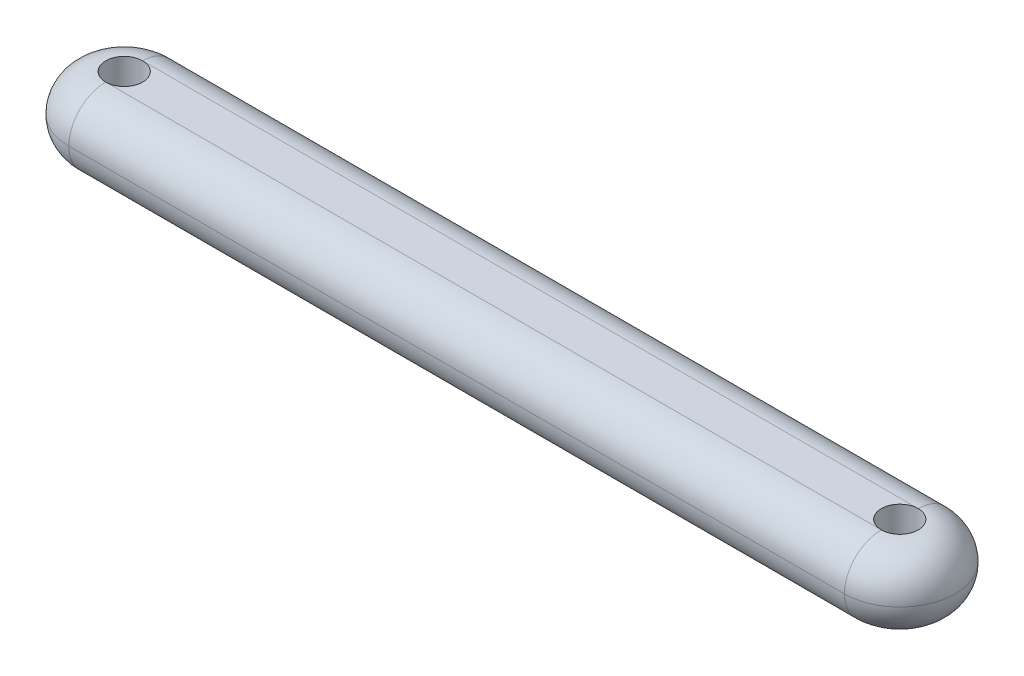
ISO-10303-21;
HEADER;
FILE_DESCRIPTION(('STEP AP214'),'2;1');
FILE_NAME('part.step','',(''),(''),'','','');
FILE_SCHEMA(('AUTOMOTIVE_DESIGN { 1 0 10303 214 1 1 1 1 }'));
ENDSEC;
DATA;
#1=APPLICATION_CONTEXT('core data for automotive mechanical design processes');
#2=APPLICATION_PROTOCOL_DEFINITION('international standard','automotive_design',2000,#1);
#3=PRODUCT_CONTEXT('',#1,'mechanical');
#4=PRODUCT('Part','Part','',(#3));
#5=PRODUCT_RELATED_PRODUCT_CATEGORY('part','',(#4));
#6=PRODUCT_DEFINITION_FORMATION('','',#4);
#7=PRODUCT_DEFINITION_CONTEXT('part definition',#1,'design');
#8=PRODUCT_DEFINITION('design','',#6,#7);
#9=PRODUCT_DEFINITION_SHAPE('','',#8);
#10=(LENGTH_UNIT() NAMED_UNIT(*) SI_UNIT(.MILLI.,.METRE.));
#11=(NAMED_UNIT(*) PLANE_ANGLE_UNIT() SI_UNIT($,.RADIAN.));
#12=(NAMED_UNIT(*) SI_UNIT($,.STERADIAN.) SOLID_ANGLE_UNIT());
#13=UNCERTAINTY_MEASURE_WITH_UNIT(LENGTH_MEASURE(1.E-05),#10,'distance_accuracy_value','');
#14=(GEOMETRIC_REPRESENTATION_CONTEXT(3) GLOBAL_UNCERTAINTY_ASSIGNED_CONTEXT((#13)) GLOBAL_UNIT_ASSIGNED_CONTEXT((#10,
#11,#12)) REPRESENTATION_CONTEXT('',''));
#15=CARTESIAN_POINT('',(0.,0.,0.));
#16=DIRECTION('',(0.,0.,1.));
#17=DIRECTION('',(1.,0.,0.));
#18=AXIS2_PLACEMENT_3D('',#15,#16,#17);
#19=CARTESIAN_POINT('',(0.,5.,0.));
#20=DIRECTION('',(0.,1.,0.));
#21=DIRECTION('',(0.,0.,1.));
#22=AXIS2_PLACEMENT_3D('',#19,#20,#21);
#23=PLANE('',#22);
#24=CARTESIAN_POINT('',(-105.,5.,0.));
#25=DIRECTION('',(0.,1.,0.));
#26=DIRECTION('',(0.,0.,1.));
#27=AXIS2_PLACEMENT_3D('',#24,#25,#26);
#28=CIRCLE('',#27,2.49999999999999);
#29=CARTESIAN_POINT('',(-105.,5.,2.49999999999999));
#30=VERTEX_POINT('',#29);
#31=CARTESIAN_POINT('',(-105.,5.,-2.5));
#32=VERTEX_POINT('',#31);
#33=EDGE_CURVE('E114',#30,#32,#28,.T.);
#34=ORIENTED_EDGE('',*,*,#33,.F.);
#35=DIRECTION('',(1.,0.,0.));
#36=VECTOR('',#35,1.);
#37=CARTESIAN_POINT('',(0.,5.,2.5));
#38=LINE('',#37,#36);
#39=CARTESIAN_POINT('',(0.,5.,2.5));
#40=VERTEX_POINT('',#39);
#41=EDGE_CURVE('E85',#30,#40,#38,.T.);
#42=ORIENTED_EDGE('',*,*,#41,.T.);
#43=CARTESIAN_POINT('',(0.,5.,0.));
#44=DIRECTION('',(0.,1.,0.));
#45=DIRECTION('',(0.,0.,1.));
#46=AXIS2_PLACEMENT_3D('',#43,#44,#45);
#47=CIRCLE('',#46,2.5);
#48=CARTESIAN_POINT('',(0.,5.,-2.5));
#49=VERTEX_POINT('',#48);
#50=EDGE_CURVE('E129',#49,#40,#47,.T.);
#51=ORIENTED_EDGE('',*,*,#50,.F.);
#52=DIRECTION('',(-1.,0.,0.));
#53=VECTOR('',#52,1.);
#54=CARTESIAN_POINT('',(-105.,5.,-2.5));
#55=LINE('',#54,#53);
#56=EDGE_CURVE('E134',#49,#32,#55,.T.);
#57=ORIENTED_EDGE('',*,*,#56,.T.);
#58=EDGE_LOOP('',(#34,#42,#51,#57));
#59=FACE_BOUND('',#58,.T.);
#60=ADVANCED_FACE('F39',(#59),#23,.T.);
#61=CARTESIAN_POINT('',(0.,-5.,0.));
#62=DIRECTION('',(0.,1.,0.));
#63=DIRECTION('',(0.,0.,1.));
#64=AXIS2_PLACEMENT_3D('',#61,#62,#63);
#65=PLANE('',#64);
#66=CARTESIAN_POINT('',(0.,-5.,0.));
#67=DIRECTION('',(0.,1.,0.));
#68=DIRECTION('',(0.,0.,1.));
#69=AXIS2_PLACEMENT_3D('',#66,#67,#68);
#70=CIRCLE('',#69,2.5);
#71=CARTESIAN_POINT('',(0.,-5.,-2.5));
#72=VERTEX_POINT('',#71);
#73=CARTESIAN_POINT('',(0.,-5.,2.5));
#74=VERTEX_POINT('',#73);
#75=EDGE_CURVE('E104',#72,#74,#70,.T.);
#76=ORIENTED_EDGE('',*,*,#75,.T.);
#77=DIRECTION('',(1.,0.,0.));
#78=VECTOR('',#77,1.);
#79=CARTESIAN_POINT('',(0.,-5.,2.5));
#80=LINE('',#79,#78);
#81=CARTESIAN_POINT('',(-105.,-5.,2.49999999999999));
#82=VERTEX_POINT('',#81);
#83=EDGE_CURVE('E11',#74,#82,#80,.F.);
#84=ORIENTED_EDGE('',*,*,#83,.T.);
#85=CARTESIAN_POINT('',(-105.,-5.,0.));
#86=DIRECTION('',(0.,1.,0.));
#87=DIRECTION('',(0.,0.,1.));
#88=AXIS2_PLACEMENT_3D('',#85,#86,#87);
#89=CIRCLE('',#88,2.49999999999999);
#90=CARTESIAN_POINT('',(-105.,-5.,-2.5));
#91=VERTEX_POINT('',#90);
#92=EDGE_CURVE('E106',#82,#91,#89,.T.);
#93=ORIENTED_EDGE('',*,*,#92,.T.);
#94=DIRECTION('',(-1.,0.,0.));
#95=VECTOR('',#94,1.);
#96=CARTESIAN_POINT('',(0.,-5.,-2.5));
#97=LINE('',#96,#95);
#98=EDGE_CURVE('E49',#91,#72,#97,.F.);
#99=ORIENTED_EDGE('',*,*,#98,.T.);
#100=EDGE_LOOP('',(#76,#84,#93,#99));
#101=FACE_BOUND('',#100,.T.);
#102=ADVANCED_FACE('F103',(#101),#65,.F.);
#103=CARTESIAN_POINT('',(0.,5.,0.));
#104=DIRECTION('',(0.,-1.,0.));
#105=DIRECTION('',(0.,0.,-1.));
#106=AXIS2_PLACEMENT_3D('',#103,#104,#105);
#107=CYLINDRICAL_SURFACE('',#106,2.5);
#108=EDGE_CURVE('E130',#40,#49,#47,.T.);
#109=ORIENTED_EDGE('',*,*,#108,.T.);
#110=ORIENTED_EDGE('',*,*,#50,.T.);
#111=EDGE_LOOP('',(#109,#110));
#112=FACE_BOUND('',#111,.T.);
#113=EDGE_CURVE('E113',#74,#72,#70,.T.);
#114=ORIENTED_EDGE('',*,*,#113,.F.);
#115=ORIENTED_EDGE('',*,*,#75,.F.);
#116=EDGE_LOOP('',(#114,#115));
#117=FACE_BOUND('',#116,.T.);
#118=ADVANCED_FACE('F111',(#112,#117),#107,.F.);
#119=CARTESIAN_POINT('',(-105.,5.,0.));
#120=DIRECTION('',(0.,-1.,0.));
#121=DIRECTION('',(0.,0.,-1.));
#122=AXIS2_PLACEMENT_3D('',#119,#120,#121);
#123=CYLINDRICAL_SURFACE('',#122,2.49999999999999);
#124=ORIENTED_EDGE('',*,*,#33,.T.);
#125=EDGE_CURVE('E160',#32,#30,#28,.T.);
#126=ORIENTED_EDGE('',*,*,#125,.T.);
#127=EDGE_LOOP('',(#124,#126));
#128=FACE_BOUND('',#127,.T.);
#129=ORIENTED_EDGE('',*,*,#92,.F.);
#130=EDGE_CURVE('E57',#91,#82,#89,.T.);
#131=ORIENTED_EDGE('',*,*,#130,.F.);
#132=EDGE_LOOP('',(#129,#131));
#133=FACE_BOUND('',#132,.T.);
#134=ADVANCED_FACE('F165',(#128,#133),#123,.F.);
#135=CARTESIAN_POINT('',(-105.,0.,0.));
#136=DIRECTION('',(0.,1.,0.));
#137=DIRECTION('',(0.,0.,1.));
#138=AXIS2_PLACEMENT_3D('',#135,#136,#137);
#139=DEGENERATE_TOROIDAL_SURFACE('',#138,2.5,5.,.T.);
#140=CARTESIAN_POINT('',(-105.,0.,-2.5));
#141=DIRECTION('',(1.,0.,0.));
#142=DIRECTION('',(0.,0.,-1.));
#143=AXIS2_PLACEMENT_3D('',#140,#141,#142);
#144=CIRCLE('',#143,5.);
#145=CARTESIAN_POINT('',(-105.,0.,-7.5));
#146=VERTEX_POINT('',#145);
#147=EDGE_CURVE('E124',#91,#146,#144,.T.);
#148=ORIENTED_EDGE('',*,*,#147,.F.);
#149=ORIENTED_EDGE('',*,*,#130,.T.);
#150=CARTESIAN_POINT('',(-105.,0.,2.5));
#151=DIRECTION('',(1.,0.,0.));
#152=DIRECTION('',(0.,0.,-1.));
#153=AXIS2_PLACEMENT_3D('',#150,#151,#152);
#154=CIRCLE('',#153,5.);
#155=CARTESIAN_POINT('',(-105.,0.,7.5));
#156=VERTEX_POINT('',#155);
#157=EDGE_CURVE('E43',#156,#82,#154,.T.);
#158=ORIENTED_EDGE('',*,*,#157,.F.);
#159=CARTESIAN_POINT('',(-105.,0.,0.));
#160=DIRECTION('',(0.,1.,0.));
#161=DIRECTION('',(0.,0.,1.));
#162=AXIS2_PLACEMENT_3D('',#159,#160,#161);
#163=CIRCLE('',#162,7.5);
#164=EDGE_CURVE('E74',#146,#156,#163,.T.);
#165=ORIENTED_EDGE('',*,*,#164,.F.);
#166=EDGE_LOOP('',(#148,#149,#158,#165));
#167=FACE_BOUND('',#166,.T.);
#168=ADVANCED_FACE('F41',(#167),#139,.T.);
#169=CARTESIAN_POINT('',(0.,0.,2.5));
#170=DIRECTION('',(1.,0.,0.));
#171=DIRECTION('',(0.,0.,-1.));
#172=AXIS2_PLACEMENT_3D('',#169,#170,#171);
#173=CYLINDRICAL_SURFACE('',#172,5.);
#174=ORIENTED_EDGE('',*,*,#157,.T.);
#175=ORIENTED_EDGE('',*,*,#83,.F.);
#176=CARTESIAN_POINT('',(0.,0.,2.5));
#177=DIRECTION('',(1.,0.,0.));
#178=DIRECTION('',(0.,0.,-1.));
#179=AXIS2_PLACEMENT_3D('',#176,#177,#178);
#180=CIRCLE('',#179,5.);
#181=CARTESIAN_POINT('',(0.,0.,7.5));
#182=VERTEX_POINT('',#181);
#183=EDGE_CURVE('E125',#182,#74,#180,.T.);
#184=ORIENTED_EDGE('',*,*,#183,.F.);
#185=DIRECTION('',(1.,0.,0.));
#186=VECTOR('',#185,1.);
#187=CARTESIAN_POINT('',(0.,0.,7.5));
#188=LINE('',#187,#186);
#189=EDGE_CURVE('E151',#156,#182,#188,.T.);
#190=ORIENTED_EDGE('',*,*,#189,.F.);
#191=EDGE_LOOP('',(#174,#175,#184,#190));
#192=FACE_BOUND('',#191,.T.);
#193=ADVANCED_FACE('F203',(#192),#173,.T.);
#194=CARTESIAN_POINT('',(-105.,0.,0.));
#195=DIRECTION('',(0.,1.,0.));
#196=DIRECTION('',(0.,0.,1.));
#197=AXIS2_PLACEMENT_3D('',#194,#195,#196);
#198=DEGENERATE_TOROIDAL_SURFACE('',#197,2.5,5.,.T.);
#199=CARTESIAN_POINT('',(-105.,0.,-2.5));
#200=DIRECTION('',(1.,0.,0.));
#201=DIRECTION('',(0.,0.,-1.));
#202=AXIS2_PLACEMENT_3D('',#199,#200,#201);
#203=CIRCLE('',#202,5.);
#204=EDGE_CURVE('E145',#146,#32,#203,.T.);
#205=ORIENTED_EDGE('',*,*,#204,.F.);
#206=ORIENTED_EDGE('',*,*,#164,.T.);
#207=CARTESIAN_POINT('',(-105.,0.,2.5));
#208=DIRECTION('',(1.,0.,0.));
#209=DIRECTION('',(0.,0.,-1.));
#210=AXIS2_PLACEMENT_3D('',#207,#208,#209);
#211=CIRCLE('',#210,5.);
#212=EDGE_CURVE('E148',#30,#156,#211,.T.);
#213=ORIENTED_EDGE('',*,*,#212,.F.);
#214=ORIENTED_EDGE('',*,*,#125,.F.);
#215=EDGE_LOOP('',(#205,#206,#213,#214));
#216=FACE_BOUND('',#215,.T.);
#217=ADVANCED_FACE('F167',(#216),#198,.T.);
#218=CARTESIAN_POINT('',(0.,0.,-2.5));
#219=DIRECTION('',(-1.,0.,0.));
#220=DIRECTION('',(0.,0.,1.));
#221=AXIS2_PLACEMENT_3D('',#218,#219,#220);
#222=CYLINDRICAL_SURFACE('',#221,5.);
#223=CARTESIAN_POINT('',(0.,0.,-2.5));
#224=DIRECTION('',(1.,0.,0.));
#225=DIRECTION('',(0.,0.,-1.));
#226=AXIS2_PLACEMENT_3D('',#223,#224,#225);
#227=CIRCLE('',#226,5.);
#228=CARTESIAN_POINT('',(0.,0.,-7.5));
#229=VERTEX_POINT('',#228);
#230=EDGE_CURVE('E117',#72,#229,#227,.T.);
#231=ORIENTED_EDGE('',*,*,#230,.F.);
#232=ORIENTED_EDGE('',*,*,#98,.F.);
#233=ORIENTED_EDGE('',*,*,#147,.T.);
#234=DIRECTION('',(-1.,0.,0.));
#235=VECTOR('',#234,1.);
#236=CARTESIAN_POINT('',(0.,0.,-7.5));
#237=LINE('',#236,#235);
#238=EDGE_CURVE('E120',#229,#146,#237,.T.);
#239=ORIENTED_EDGE('',*,*,#238,.F.);
#240=EDGE_LOOP('',(#231,#232,#233,#239));
#241=FACE_BOUND('',#240,.T.);
#242=ADVANCED_FACE('F118',(#241),#222,.T.);
#243=CARTESIAN_POINT('',(0.,0.,0.));
#244=DIRECTION('',(0.,1.,0.));
#245=DIRECTION('',(0.,0.,1.));
#246=AXIS2_PLACEMENT_3D('',#243,#244,#245);
#247=DEGENERATE_TOROIDAL_SURFACE('',#246,2.5,5.,.T.);
#248=ORIENTED_EDGE('',*,*,#113,.T.);
#249=ORIENTED_EDGE('',*,*,#230,.T.);
#250=CARTESIAN_POINT('',(0.,0.,0.));
#251=DIRECTION('',(0.,1.,0.));
#252=DIRECTION('',(0.,0.,1.));
#253=AXIS2_PLACEMENT_3D('',#250,#251,#252);
#254=CIRCLE('',#253,7.5);
#255=EDGE_CURVE('E142',#182,#229,#254,.T.);
#256=ORIENTED_EDGE('',*,*,#255,.F.);
#257=ORIENTED_EDGE('',*,*,#183,.T.);
#258=EDGE_LOOP('',(#248,#249,#256,#257));
#259=FACE_BOUND('',#258,.T.);
#260=ADVANCED_FACE('F127',(#259),#247,.T.);
#261=CARTESIAN_POINT('',(0.,0.,2.5));
#262=DIRECTION('',(-1.,0.,0.));
#263=DIRECTION('',(0.,0.,1.));
#264=AXIS2_PLACEMENT_3D('',#261,#262,#263);
#265=CYLINDRICAL_SURFACE('',#264,5.);
#266=ORIENTED_EDGE('',*,*,#212,.T.);
#267=ORIENTED_EDGE('',*,*,#189,.T.);
#268=CARTESIAN_POINT('',(0.,0.,2.5));
#269=DIRECTION('',(1.,0.,0.));
#270=DIRECTION('',(0.,0.,-1.));
#271=AXIS2_PLACEMENT_3D('',#268,#269,#270);
#272=CIRCLE('',#271,5.);
#273=EDGE_CURVE('E139',#40,#182,#272,.T.);
#274=ORIENTED_EDGE('',*,*,#273,.F.);
#275=ORIENTED_EDGE('',*,*,#41,.F.);
#276=EDGE_LOOP('',(#266,#267,#274,#275));
#277=FACE_BOUND('',#276,.T.);
#278=ADVANCED_FACE('F170',(#277),#265,.T.);
#279=CARTESIAN_POINT('',(0.,0.,-2.5));
#280=DIRECTION('',(1.,0.,0.));
#281=DIRECTION('',(0.,0.,-1.));
#282=AXIS2_PLACEMENT_3D('',#279,#280,#281);
#283=CYLINDRICAL_SURFACE('',#282,5.);
#284=ORIENTED_EDGE('',*,*,#204,.T.);
#285=ORIENTED_EDGE('',*,*,#56,.F.);
#286=CARTESIAN_POINT('',(0.,0.,-2.5));
#287=DIRECTION('',(1.,0.,0.));
#288=DIRECTION('',(0.,0.,-1.));
#289=AXIS2_PLACEMENT_3D('',#286,#287,#288);
#290=CIRCLE('',#289,5.);
#291=EDGE_CURVE('E137',#229,#49,#290,.T.);
#292=ORIENTED_EDGE('',*,*,#291,.F.);
#293=ORIENTED_EDGE('',*,*,#238,.T.);
#294=EDGE_LOOP('',(#284,#285,#292,#293));
#295=FACE_BOUND('',#294,.T.);
#296=ADVANCED_FACE('F192',(#295),#283,.T.);
#297=CARTESIAN_POINT('',(0.,0.,0.));
#298=DIRECTION('',(0.,1.,0.));
#299=DIRECTION('',(0.,0.,1.));
#300=AXIS2_PLACEMENT_3D('',#297,#298,#299);
#301=DEGENERATE_TOROIDAL_SURFACE('',#300,2.5,5.,.T.);
#302=ORIENTED_EDGE('',*,*,#273,.T.);
#303=ORIENTED_EDGE('',*,*,#255,.T.);
#304=ORIENTED_EDGE('',*,*,#291,.T.);
#305=ORIENTED_EDGE('',*,*,#108,.F.);
#306=EDGE_LOOP('',(#302,#303,#304,#305));
#307=FACE_BOUND('',#306,.T.);
#308=ADVANCED_FACE('F174',(#307),#301,.T.);
#309=CLOSED_SHELL('',(#60,#102,#118,#134,#168,#193,#217,#242,#260,#278,#296,#308));
#310=MANIFOLD_SOLID_BREP('B2',#309);
#311=ADVANCED_BREP_SHAPE_REPRESENTATION('',(#18,#310),#14);
#312=SHAPE_DEFINITION_REPRESENTATION(#9,#311);
ENDSEC;
END-ISO-10303-21;
